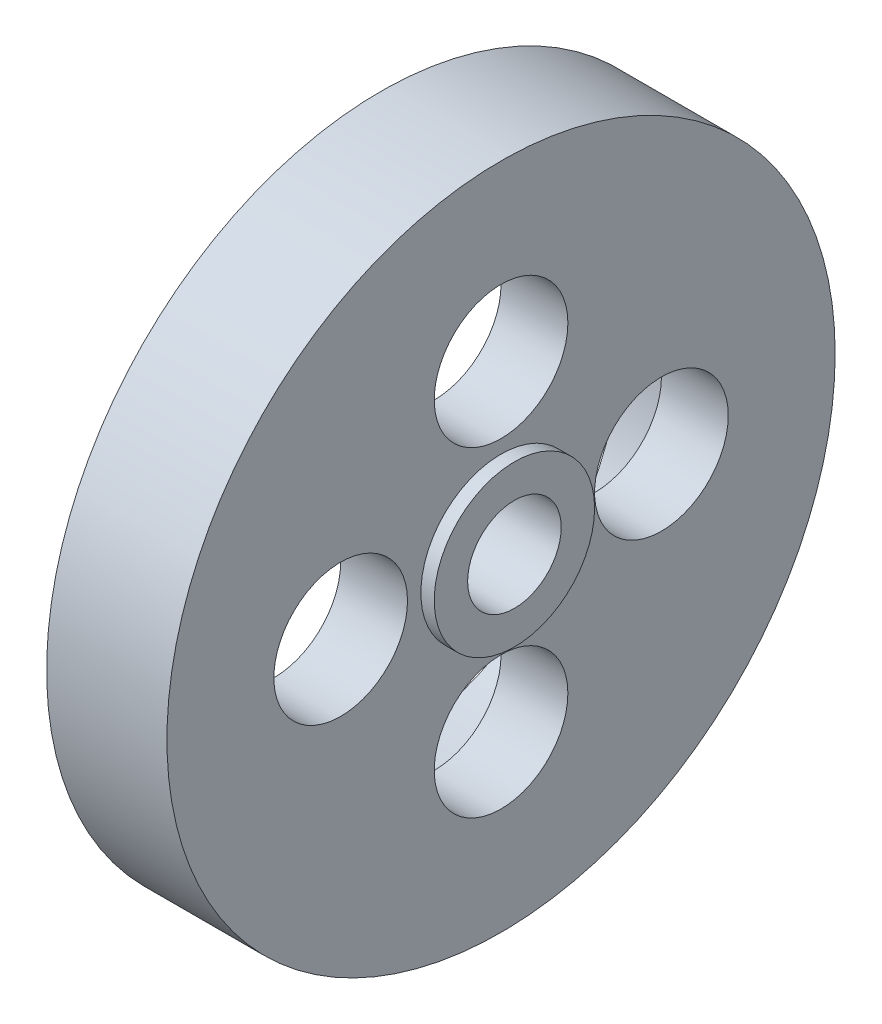
ISO-10303-21;
HEADER;
FILE_DESCRIPTION(('STEP AP214'),'2;1');
FILE_NAME('part.step','',(''),(''),'','','');
FILE_SCHEMA(('AUTOMOTIVE_DESIGN { 1 0 10303 214 1 1 1 1 }'));
ENDSEC;
DATA;
#1=APPLICATION_CONTEXT('core data for automotive mechanical design processes');
#2=APPLICATION_PROTOCOL_DEFINITION('international standard','automotive_design',2000,#1);
#3=PRODUCT_CONTEXT('',#1,'mechanical');
#4=PRODUCT('Part','Part','',(#3));
#5=PRODUCT_RELATED_PRODUCT_CATEGORY('part','',(#4));
#6=PRODUCT_DEFINITION_FORMATION('','',#4);
#7=PRODUCT_DEFINITION_CONTEXT('part definition',#1,'design');
#8=PRODUCT_DEFINITION('design','',#6,#7);
#9=PRODUCT_DEFINITION_SHAPE('','',#8);
#10=(LENGTH_UNIT() NAMED_UNIT(*) SI_UNIT(.MILLI.,.METRE.));
#11=(NAMED_UNIT(*) PLANE_ANGLE_UNIT() SI_UNIT($,.RADIAN.));
#12=(NAMED_UNIT(*) SI_UNIT($,.STERADIAN.) SOLID_ANGLE_UNIT());
#13=UNCERTAINTY_MEASURE_WITH_UNIT(LENGTH_MEASURE(1.E-05),#10,'distance_accuracy_value','');
#14=(GEOMETRIC_REPRESENTATION_CONTEXT(3) GLOBAL_UNCERTAINTY_ASSIGNED_CONTEXT((#13)) GLOBAL_UNIT_ASSIGNED_CONTEXT((#10,
#11,#12)) REPRESENTATION_CONTEXT('',''));
#15=CARTESIAN_POINT('',(0.,0.,0.));
#16=DIRECTION('',(0.,0.,1.));
#17=DIRECTION('',(1.,0.,0.));
#18=AXIS2_PLACEMENT_3D('',#15,#16,#17);
#19=CARTESIAN_POINT('',(10.,0.,0.));
#20=DIRECTION('',(-1.,0.,0.));
#21=DIRECTION('',(0.,0.,1.));
#22=AXIS2_PLACEMENT_3D('',#19,#20,#21);
#23=CYLINDRICAL_SURFACE('',#22,3.5);
#24=CARTESIAN_POINT('',(10.,0.,0.));
#25=DIRECTION('',(1.,0.,0.));
#26=DIRECTION('',(0.,0.,-1.));
#27=AXIS2_PLACEMENT_3D('',#24,#25,#26);
#28=CIRCLE('',#27,3.5);
#29=CARTESIAN_POINT('',(10.,0.,-3.5));
#30=VERTEX_POINT('',#29);
#31=EDGE_CURVE('E53',#30,#30,#28,.T.);
#32=ORIENTED_EDGE('',*,*,#31,.T.);
#33=EDGE_LOOP('',(#32));
#34=FACE_BOUND('',#33,.T.);
#35=CARTESIAN_POINT('',(4.,0.,0.));
#36=DIRECTION('',(-1.,0.,0.));
#37=DIRECTION('',(0.,0.,1.));
#38=AXIS2_PLACEMENT_3D('',#35,#36,#37);
#39=CIRCLE('',#38,3.5);
#40=CARTESIAN_POINT('',(4.,0.,3.5));
#41=VERTEX_POINT('',#40);
#42=EDGE_CURVE('E73',#41,#41,#39,.T.);
#43=ORIENTED_EDGE('',*,*,#42,.T.);
#44=EDGE_LOOP('',(#43));
#45=FACE_BOUND('',#44,.T.);
#46=ADVANCED_FACE('F45',(#34,#45),#23,.F.);
#47=CARTESIAN_POINT('',(0.,-3.4032572508536E-13,11.9999999999997));
#48=DIRECTION('',(1.,0.,0.));
#49=DIRECTION('',(0.,0.,-1.));
#50=AXIS2_PLACEMENT_3D('',#47,#48,#49);
#51=CYLINDRICAL_SURFACE('',#50,5.00000000000055);
#52=CARTESIAN_POINT('',(9.,-3.4032572508536E-13,11.9999999999997));
#53=DIRECTION('',(1.,0.,0.));
#54=DIRECTION('',(0.,0.,-1.));
#55=AXIS2_PLACEMENT_3D('',#52,#53,#54);
#56=CIRCLE('',#55,5.00000000000055);
#57=CARTESIAN_POINT('',(9.,-3.4032572508536E-13,6.99999999999912));
#58=VERTEX_POINT('',#57);
#59=EDGE_CURVE('E69',#58,#58,#56,.T.);
#60=ORIENTED_EDGE('',*,*,#59,.T.);
#61=EDGE_LOOP('',(#60));
#62=FACE_BOUND('',#61,.T.);
#63=CARTESIAN_POINT('',(4.,-3.4032572508536E-13,11.9999999999997));
#64=DIRECTION('',(-1.,0.,0.));
#65=DIRECTION('',(0.,0.,1.));
#66=AXIS2_PLACEMENT_3D('',#63,#64,#65);
#67=CIRCLE('',#66,5.00000000000055);
#68=CARTESIAN_POINT('',(4.,-3.4032572508536E-13,17.0000000000002));
#69=VERTEX_POINT('',#68);
#70=EDGE_CURVE('E83',#69,#69,#67,.F.);
#71=ORIENTED_EDGE('',*,*,#70,.F.);
#72=EDGE_LOOP('',(#71));
#73=FACE_BOUND('',#72,.T.);
#74=ADVANCED_FACE('F122',(#62,#73),#51,.F.);
#75=CARTESIAN_POINT('',(0.,-12.,-6.77712297852766E-13));
#76=DIRECTION('',(1.,0.,0.));
#77=DIRECTION('',(0.,0.,-1.));
#78=AXIS2_PLACEMENT_3D('',#75,#76,#77);
#79=CYLINDRICAL_SURFACE('',#78,5.00000000000073);
#80=CARTESIAN_POINT('',(9.,-12.,-6.77712297852766E-13));
#81=DIRECTION('',(1.,0.,0.));
#82=DIRECTION('',(0.,0.,-1.));
#83=AXIS2_PLACEMENT_3D('',#80,#81,#82);
#84=CIRCLE('',#83,5.00000000000073);
#85=CARTESIAN_POINT('',(9.,-12.,-5.00000000000141));
#86=VERTEX_POINT('',#85);
#87=EDGE_CURVE('E72',#86,#86,#84,.T.);
#88=ORIENTED_EDGE('',*,*,#87,.T.);
#89=EDGE_LOOP('',(#88));
#90=FACE_BOUND('',#89,.T.);
#91=CARTESIAN_POINT('',(4.,-12.,-6.77712297852766E-13));
#92=DIRECTION('',(-1.,0.,0.));
#93=DIRECTION('',(0.,0.,1.));
#94=AXIS2_PLACEMENT_3D('',#91,#92,#93);
#95=CIRCLE('',#94,5.00000000000073);
#96=CARTESIAN_POINT('',(4.,-12.,5.00000000000005));
#97=VERTEX_POINT('',#96);
#98=EDGE_CURVE('E86',#97,#97,#95,.F.);
#99=ORIENTED_EDGE('',*,*,#98,.F.);
#100=EDGE_LOOP('',(#99));
#101=FACE_BOUND('',#100,.T.);
#102=ADVANCED_FACE('F117',(#90,#101),#79,.F.);
#103=CARTESIAN_POINT('',(0.,3.38856148926383E-13,-12.0000000000003));
#104=DIRECTION('',(1.,0.,0.));
#105=DIRECTION('',(0.,0.,-1.));
#106=AXIS2_PLACEMENT_3D('',#103,#104,#105);
#107=CYLINDRICAL_SURFACE('',#106,5.00000000000027);
#108=CARTESIAN_POINT('',(9.,3.38856148926383E-13,-12.0000000000003));
#109=DIRECTION('',(1.,0.,0.));
#110=DIRECTION('',(0.,0.,-1.));
#111=AXIS2_PLACEMENT_3D('',#108,#109,#110);
#112=CIRCLE('',#111,5.00000000000027);
#113=CARTESIAN_POINT('',(9.,3.38856148926383E-13,-17.0000000000006));
#114=VERTEX_POINT('',#113);
#115=EDGE_CURVE('E76',#114,#114,#112,.T.);
#116=ORIENTED_EDGE('',*,*,#115,.T.);
#117=EDGE_LOOP('',(#116));
#118=FACE_BOUND('',#117,.T.);
#119=CARTESIAN_POINT('',(4.,3.38856148926383E-13,-12.0000000000003));
#120=DIRECTION('',(-1.,0.,0.));
#121=DIRECTION('',(0.,0.,1.));
#122=AXIS2_PLACEMENT_3D('',#119,#120,#121);
#123=CIRCLE('',#122,5.00000000000027);
#124=CARTESIAN_POINT('',(4.,3.38856148926383E-13,-7.00000000000007));
#125=VERTEX_POINT('',#124);
#126=EDGE_CURVE('E89',#125,#125,#123,.F.);
#127=ORIENTED_EDGE('',*,*,#126,.F.);
#128=EDGE_LOOP('',(#127));
#129=FACE_BOUND('',#128,.T.);
#130=ADVANCED_FACE('F108',(#118,#129),#107,.F.);
#131=CARTESIAN_POINT('',(0.,12.,0.));
#132=DIRECTION('',(1.,0.,0.));
#133=DIRECTION('',(0.,0.,-1.));
#134=AXIS2_PLACEMENT_3D('',#131,#132,#133);
#135=CYLINDRICAL_SURFACE('',#134,5.);
#136=CARTESIAN_POINT('',(9.,12.,0.));
#137=DIRECTION('',(1.,0.,0.));
#138=DIRECTION('',(0.,0.,-1.));
#139=AXIS2_PLACEMENT_3D('',#136,#137,#138);
#140=CIRCLE('',#139,5.);
#141=CARTESIAN_POINT('',(9.,12.,-5.));
#142=VERTEX_POINT('',#141);
#143=EDGE_CURVE('E66',#142,#142,#140,.T.);
#144=ORIENTED_EDGE('',*,*,#143,.T.);
#145=EDGE_LOOP('',(#144));
#146=FACE_BOUND('',#145,.T.);
#147=CARTESIAN_POINT('',(4.,12.,0.));
#148=DIRECTION('',(-1.,0.,0.));
#149=DIRECTION('',(0.,0.,1.));
#150=AXIS2_PLACEMENT_3D('',#147,#148,#149);
#151=CIRCLE('',#150,5.);
#152=CARTESIAN_POINT('',(4.,12.,5.));
#153=VERTEX_POINT('',#152);
#154=EDGE_CURVE('E49',#153,#153,#151,.F.);
#155=ORIENTED_EDGE('',*,*,#154,.F.);
#156=EDGE_LOOP('',(#155));
#157=FACE_BOUND('',#156,.T.);
#158=ADVANCED_FACE('F105',(#146,#157),#135,.F.);
#159=CARTESIAN_POINT('',(10.,0.,0.));
#160=DIRECTION('',(1.,0.,0.));
#161=DIRECTION('',(0.,0.,-1.));
#162=AXIS2_PLACEMENT_3D('',#159,#160,#161);
#163=PLANE('',#162);
#164=ORIENTED_EDGE('',*,*,#31,.F.);
#165=EDGE_LOOP('',(#164));
#166=FACE_BOUND('',#165,.T.);
#167=CARTESIAN_POINT('',(10.,0.,0.));
#168=DIRECTION('',(1.,0.,0.));
#169=DIRECTION('',(0.,0.,-1.));
#170=AXIS2_PLACEMENT_3D('',#167,#168,#169);
#171=CIRCLE('',#170,6.);
#172=CARTESIAN_POINT('',(10.,0.,-6.));
#173=VERTEX_POINT('',#172);
#174=EDGE_CURVE('E63',#173,#173,#171,.T.);
#175=ORIENTED_EDGE('',*,*,#174,.T.);
#176=EDGE_LOOP('',(#175));
#177=FACE_BOUND('',#176,.T.);
#178=ADVANCED_FACE('F107',(#166,#177),#163,.T.);
#179=CARTESIAN_POINT('',(10.,0.,0.));
#180=DIRECTION('',(-1.,0.,0.));
#181=DIRECTION('',(0.,0.,1.));
#182=AXIS2_PLACEMENT_3D('',#179,#180,#181);
#183=CYLINDRICAL_SURFACE('',#182,25.);
#184=CARTESIAN_POINT('',(0.,0.,0.));
#185=DIRECTION('',(1.,0.,0.));
#186=DIRECTION('',(0.,0.,-1.));
#187=AXIS2_PLACEMENT_3D('',#184,#185,#186);
#188=CIRCLE('',#187,25.);
#189=CARTESIAN_POINT('',(0.,0.,-25.));
#190=VERTEX_POINT('',#189);
#191=EDGE_CURVE('E10',#190,#190,#188,.T.);
#192=ORIENTED_EDGE('',*,*,#191,.T.);
#193=EDGE_LOOP('',(#192));
#194=FACE_BOUND('',#193,.T.);
#195=CARTESIAN_POINT('',(9.,0.,0.));
#196=DIRECTION('',(1.,0.,0.));
#197=DIRECTION('',(0.,0.,-1.));
#198=AXIS2_PLACEMENT_3D('',#195,#196,#197);
#199=CIRCLE('',#198,25.);
#200=CARTESIAN_POINT('',(9.,0.,-25.));
#201=VERTEX_POINT('',#200);
#202=EDGE_CURVE('E57',#201,#201,#199,.T.);
#203=ORIENTED_EDGE('',*,*,#202,.F.);
#204=EDGE_LOOP('',(#203));
#205=FACE_BOUND('',#204,.T.);
#206=ADVANCED_FACE('F47',(#194,#205),#183,.T.);
#207=CARTESIAN_POINT('',(0.,0.,0.));
#208=DIRECTION('',(1.,0.,0.));
#209=DIRECTION('',(0.,0.,-1.));
#210=AXIS2_PLACEMENT_3D('',#207,#208,#209);
#211=PLANE('',#210);
#212=CARTESIAN_POINT('',(0.,0.,0.));
#213=DIRECTION('',(-1.,0.,0.));
#214=DIRECTION('',(0.,0.,1.));
#215=AXIS2_PLACEMENT_3D('',#212,#213,#214);
#216=CIRCLE('',#215,18.);
#217=CARTESIAN_POINT('',(0.,0.,18.));
#218=VERTEX_POINT('',#217);
#219=EDGE_CURVE('E92',#218,#218,#216,.T.);
#220=ORIENTED_EDGE('',*,*,#219,.F.);
#221=EDGE_LOOP('',(#220));
#222=FACE_BOUND('',#221,.T.);
#223=ORIENTED_EDGE('',*,*,#191,.F.);
#224=EDGE_LOOP('',(#223));
#225=FACE_BOUND('',#224,.T.);
#226=ADVANCED_FACE('F136',(#222,#225),#211,.F.);
#227=CARTESIAN_POINT('',(9.,0.,0.));
#228=DIRECTION('',(1.,0.,0.));
#229=DIRECTION('',(0.,0.,-1.));
#230=AXIS2_PLACEMENT_3D('',#227,#228,#229);
#231=PLANE('',#230);
#232=ORIENTED_EDGE('',*,*,#143,.F.);
#233=EDGE_LOOP('',(#232));
#234=FACE_BOUND('',#233,.T.);
#235=ORIENTED_EDGE('',*,*,#115,.F.);
#236=EDGE_LOOP('',(#235));
#237=FACE_BOUND('',#236,.T.);
#238=ORIENTED_EDGE('',*,*,#87,.F.);
#239=EDGE_LOOP('',(#238));
#240=FACE_BOUND('',#239,.T.);
#241=ORIENTED_EDGE('',*,*,#59,.F.);
#242=EDGE_LOOP('',(#241));
#243=FACE_BOUND('',#242,.T.);
#244=CARTESIAN_POINT('',(9.,0.,0.));
#245=DIRECTION('',(1.,0.,0.));
#246=DIRECTION('',(0.,0.,-1.));
#247=AXIS2_PLACEMENT_3D('',#244,#245,#246);
#248=CIRCLE('',#247,6.);
#249=CARTESIAN_POINT('',(9.,0.,-6.));
#250=VERTEX_POINT('',#249);
#251=EDGE_CURVE('E62',#250,#250,#248,.T.);
#252=ORIENTED_EDGE('',*,*,#251,.F.);
#253=EDGE_LOOP('',(#252));
#254=FACE_BOUND('',#253,.T.);
#255=ORIENTED_EDGE('',*,*,#202,.T.);
#256=EDGE_LOOP('',(#255));
#257=FACE_BOUND('',#256,.T.);
#258=ADVANCED_FACE('F134',(#234,#237,#240,#243,#254,#257),#231,.T.);
#259=CARTESIAN_POINT('',(9.,0.,0.));
#260=DIRECTION('',(1.,0.,0.));
#261=DIRECTION('',(0.,0.,-1.));
#262=AXIS2_PLACEMENT_3D('',#259,#260,#261);
#263=CYLINDRICAL_SURFACE('',#262,6.);
#264=ORIENTED_EDGE('',*,*,#251,.T.);
#265=EDGE_LOOP('',(#264));
#266=FACE_BOUND('',#265,.T.);
#267=ORIENTED_EDGE('',*,*,#174,.F.);
#268=EDGE_LOOP('',(#267));
#269=FACE_BOUND('',#268,.T.);
#270=ADVANCED_FACE('F143',(#266,#269),#263,.T.);
#271=CARTESIAN_POINT('',(4.,0.,0.));
#272=DIRECTION('',(-1.,0.,0.));
#273=DIRECTION('',(0.,0.,1.));
#274=AXIS2_PLACEMENT_3D('',#271,#272,#273);
#275=PLANE('',#274);
#276=ORIENTED_EDGE('',*,*,#42,.F.);
#277=EDGE_LOOP('',(#276));
#278=FACE_BOUND('',#277,.T.);
#279=CARTESIAN_POINT('',(4.,0.,0.));
#280=DIRECTION('',(-1.,0.,0.));
#281=DIRECTION('',(0.,0.,1.));
#282=AXIS2_PLACEMENT_3D('',#279,#280,#281);
#283=CIRCLE('',#282,18.);
#284=CARTESIAN_POINT('',(4.,0.,18.));
#285=VERTEX_POINT('',#284);
#286=EDGE_CURVE('E95',#285,#285,#283,.T.);
#287=ORIENTED_EDGE('',*,*,#286,.T.);
#288=EDGE_LOOP('',(#287));
#289=FACE_BOUND('',#288,.T.);
#290=ORIENTED_EDGE('',*,*,#154,.T.);
#291=EDGE_LOOP('',(#290));
#292=FACE_BOUND('',#291,.T.);
#293=ORIENTED_EDGE('',*,*,#126,.T.);
#294=EDGE_LOOP('',(#293));
#295=FACE_BOUND('',#294,.T.);
#296=ORIENTED_EDGE('',*,*,#98,.T.);
#297=EDGE_LOOP('',(#296));
#298=FACE_BOUND('',#297,.T.);
#299=ORIENTED_EDGE('',*,*,#70,.T.);
#300=EDGE_LOOP('',(#299));
#301=FACE_BOUND('',#300,.T.);
#302=ADVANCED_FACE('F102',(#278,#289,#292,#295,#298,#301),#275,.T.);
#303=CARTESIAN_POINT('',(4.,0.,0.));
#304=DIRECTION('',(-1.,0.,0.));
#305=DIRECTION('',(0.,0.,1.));
#306=AXIS2_PLACEMENT_3D('',#303,#304,#305);
#307=CYLINDRICAL_SURFACE('',#306,18.);
#308=ORIENTED_EDGE('',*,*,#286,.F.);
#309=EDGE_LOOP('',(#308));
#310=FACE_BOUND('',#309,.T.);
#311=ORIENTED_EDGE('',*,*,#219,.T.);
#312=EDGE_LOOP('',(#311));
#313=FACE_BOUND('',#312,.T.);
#314=ADVANCED_FACE('F148',(#310,#313),#307,.F.);
#315=CLOSED_SHELL('',(#46,#74,#102,#130,#158,#178,#206,#226,#258,#270,#302,#314));
#316=MANIFOLD_SOLID_BREP('B2',#315);
#317=ADVANCED_BREP_SHAPE_REPRESENTATION('',(#18,#316),#14);
#318=SHAPE_DEFINITION_REPRESENTATION(#9,#317);
ENDSEC;
END-ISO-10303-21;
